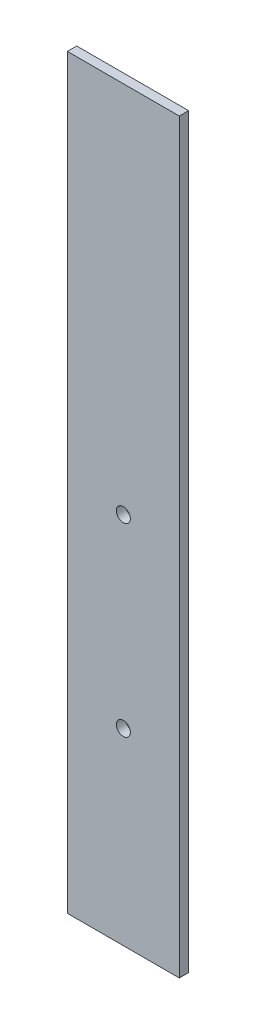
ISO-10303-21;
HEADER;
FILE_DESCRIPTION(('STEP AP214'),'2;1');
FILE_NAME('part.step','',(''),(''),'','','');
FILE_SCHEMA(('AUTOMOTIVE_DESIGN { 1 0 10303 214 1 1 1 1 }'));
ENDSEC;
DATA;
#1=APPLICATION_CONTEXT('core data for automotive mechanical design processes');
#2=APPLICATION_PROTOCOL_DEFINITION('international standard','automotive_design',2000,#1);
#3=PRODUCT_CONTEXT('',#1,'mechanical');
#4=PRODUCT('Part','Part','',(#3));
#5=PRODUCT_RELATED_PRODUCT_CATEGORY('part','',(#4));
#6=PRODUCT_DEFINITION_FORMATION('','',#4);
#7=PRODUCT_DEFINITION_CONTEXT('part definition',#1,'design');
#8=PRODUCT_DEFINITION('design','',#6,#7);
#9=PRODUCT_DEFINITION_SHAPE('','',#8);
#10=(LENGTH_UNIT() NAMED_UNIT(*) SI_UNIT(.MILLI.,.METRE.));
#11=(NAMED_UNIT(*) PLANE_ANGLE_UNIT() SI_UNIT($,.RADIAN.));
#12=(NAMED_UNIT(*) SI_UNIT($,.STERADIAN.) SOLID_ANGLE_UNIT());
#13=UNCERTAINTY_MEASURE_WITH_UNIT(LENGTH_MEASURE(1.E-05),#10,'distance_accuracy_value','');
#14=(GEOMETRIC_REPRESENTATION_CONTEXT(3) GLOBAL_UNCERTAINTY_ASSIGNED_CONTEXT((#13)) GLOBAL_UNIT_ASSIGNED_CONTEXT((#10,
#11,#12)) REPRESENTATION_CONTEXT('',''));
#15=CARTESIAN_POINT('',(0.,0.,0.));
#16=DIRECTION('',(0.,0.,1.));
#17=DIRECTION('',(1.,0.,0.));
#18=AXIS2_PLACEMENT_3D('',#15,#16,#17);
#19=CARTESIAN_POINT('',(0.,0.,3.175));
#20=DIRECTION('',(0.,0.,1.));
#21=DIRECTION('',(1.,0.,0.));
#22=AXIS2_PLACEMENT_3D('',#19,#20,#21);
#23=PLANE('',#22);
#24=CARTESIAN_POINT('',(19.05,-189.97100921089,3.175));
#25=DIRECTION('',(0.,0.,1.));
#26=DIRECTION('',(1.,0.,0.));
#27=AXIS2_PLACEMENT_3D('',#24,#25,#26);
#28=CIRCLE('',#27,2.38125);
#29=CARTESIAN_POINT('',(21.43125,-189.97100921089,3.175));
#30=VERTEX_POINT('',#29);
#31=EDGE_CURVE('E112',#30,#30,#28,.T.);
#32=ORIENTED_EDGE('',*,*,#31,.F.);
#33=EDGE_LOOP('',(#32));
#34=FACE_BOUND('',#33,.T.);
#35=DIRECTION('',(0.,-1.,0.));
#36=VECTOR('',#35,1.);
#37=CARTESIAN_POINT('',(0.,0.,3.175));
#38=LINE('',#37,#36);
#39=CARTESIAN_POINT('',(0.,0.,3.175));
#40=VERTEX_POINT('',#39);
#41=CARTESIAN_POINT('',(0.,-254.,3.175));
#42=VERTEX_POINT('',#41);
#43=EDGE_CURVE('E92',#40,#42,#38,.T.);
#44=ORIENTED_EDGE('',*,*,#43,.T.);
#45=DIRECTION('',(1.,0.,0.));
#46=VECTOR('',#45,1.);
#47=CARTESIAN_POINT('',(0.,-254.,3.175));
#48=LINE('',#47,#46);
#49=CARTESIAN_POINT('',(38.1,-254.,3.175));
#50=VERTEX_POINT('',#49);
#51=EDGE_CURVE('E87',#42,#50,#48,.T.);
#52=ORIENTED_EDGE('',*,*,#51,.T.);
#53=DIRECTION('',(0.,1.,0.));
#54=VECTOR('',#53,1.);
#55=CARTESIAN_POINT('',(38.1,0.,3.175));
#56=LINE('',#55,#54);
#57=CARTESIAN_POINT('',(38.1,0.,3.175));
#58=VERTEX_POINT('',#57);
#59=EDGE_CURVE('E90',#50,#58,#56,.T.);
#60=ORIENTED_EDGE('',*,*,#59,.T.);
#61=DIRECTION('',(-1.,0.,0.));
#62=VECTOR('',#61,1.);
#63=CARTESIAN_POINT('',(0.,0.,3.175));
#64=LINE('',#63,#62);
#65=EDGE_CURVE('E57',#58,#40,#64,.T.);
#66=ORIENTED_EDGE('',*,*,#65,.T.);
#67=EDGE_LOOP('',(#44,#52,#60,#66));
#68=FACE_BOUND('',#67,.T.);
#69=CARTESIAN_POINT('',(19.05,-127.,3.175));
#70=DIRECTION('',(0.,0.,1.));
#71=DIRECTION('',(1.,0.,0.));
#72=AXIS2_PLACEMENT_3D('',#69,#70,#71);
#73=CIRCLE('',#72,2.38125);
#74=CARTESIAN_POINT('',(21.43125,-127.,3.175));
#75=VERTEX_POINT('',#74);
#76=EDGE_CURVE('E134',#75,#75,#73,.T.);
#77=ORIENTED_EDGE('',*,*,#76,.F.);
#78=EDGE_LOOP('',(#77));
#79=FACE_BOUND('',#78,.T.);
#80=ADVANCED_FACE('F39',(#34,#68,#79),#23,.T.);
#81=CARTESIAN_POINT('',(0.,0.,0.));
#82=DIRECTION('',(0.,0.,1.));
#83=DIRECTION('',(1.,0.,0.));
#84=AXIS2_PLACEMENT_3D('',#81,#82,#83);
#85=PLANE('',#84);
#86=DIRECTION('',(0.,-1.,0.));
#87=VECTOR('',#86,1.);
#88=CARTESIAN_POINT('',(0.,0.,0.));
#89=LINE('',#88,#87);
#90=CARTESIAN_POINT('',(0.,0.,0.));
#91=VERTEX_POINT('',#90);
#92=CARTESIAN_POINT('',(0.,-254.,0.));
#93=VERTEX_POINT('',#92);
#94=EDGE_CURVE('E108',#91,#93,#89,.T.);
#95=ORIENTED_EDGE('',*,*,#94,.F.);
#96=DIRECTION('',(-1.,0.,0.));
#97=VECTOR('',#96,1.);
#98=CARTESIAN_POINT('',(0.,0.,0.));
#99=LINE('',#98,#97);
#100=CARTESIAN_POINT('',(38.1,0.,0.));
#101=VERTEX_POINT('',#100);
#102=EDGE_CURVE('E80',#101,#91,#99,.T.);
#103=ORIENTED_EDGE('',*,*,#102,.F.);
#104=DIRECTION('',(0.,1.,0.));
#105=VECTOR('',#104,1.);
#106=CARTESIAN_POINT('',(38.1,0.,0.));
#107=LINE('',#106,#105);
#108=CARTESIAN_POINT('',(38.1,-254.,0.));
#109=VERTEX_POINT('',#108);
#110=EDGE_CURVE('E74',#109,#101,#107,.T.);
#111=ORIENTED_EDGE('',*,*,#110,.F.);
#112=DIRECTION('',(1.,0.,0.));
#113=VECTOR('',#112,1.);
#114=CARTESIAN_POINT('',(0.,-254.,0.));
#115=LINE('',#114,#113);
#116=EDGE_CURVE('E97',#93,#109,#115,.T.);
#117=ORIENTED_EDGE('',*,*,#116,.F.);
#118=EDGE_LOOP('',(#95,#103,#111,#117));
#119=FACE_BOUND('',#118,.T.);
#120=CARTESIAN_POINT('',(19.05,-189.97100921089,0.));
#121=DIRECTION('',(0.,0.,1.));
#122=DIRECTION('',(1.,0.,0.));
#123=AXIS2_PLACEMENT_3D('',#120,#121,#122);
#124=CIRCLE('',#123,2.38125);
#125=CARTESIAN_POINT('',(21.43125,-189.97100921089,0.));
#126=VERTEX_POINT('',#125);
#127=EDGE_CURVE('E130',#126,#126,#124,.T.);
#128=ORIENTED_EDGE('',*,*,#127,.T.);
#129=EDGE_LOOP('',(#128));
#130=FACE_BOUND('',#129,.T.);
#131=CARTESIAN_POINT('',(19.05,-127.,0.));
#132=DIRECTION('',(0.,0.,1.));
#133=DIRECTION('',(1.,0.,0.));
#134=AXIS2_PLACEMENT_3D('',#131,#132,#133);
#135=CIRCLE('',#134,2.38125);
#136=CARTESIAN_POINT('',(21.43125,-127.,0.));
#137=VERTEX_POINT('',#136);
#138=EDGE_CURVE('E138',#137,#137,#135,.T.);
#139=ORIENTED_EDGE('',*,*,#138,.T.);
#140=EDGE_LOOP('',(#139));
#141=FACE_BOUND('',#140,.T.);
#142=ADVANCED_FACE('F125',(#119,#130,#141),#85,.F.);
#143=CARTESIAN_POINT('',(0.,0.,3.175));
#144=DIRECTION('',(1.,0.,0.));
#145=DIRECTION('',(0.,0.,-1.));
#146=AXIS2_PLACEMENT_3D('',#143,#144,#145);
#147=PLANE('',#146);
#148=ORIENTED_EDGE('',*,*,#94,.T.);
#149=DIRECTION('',(0.,0.,-1.));
#150=VECTOR('',#149,1.);
#151=CARTESIAN_POINT('',(0.,-254.,3.175));
#152=LINE('',#151,#150);
#153=EDGE_CURVE('E11',#42,#93,#152,.T.);
#154=ORIENTED_EDGE('',*,*,#153,.F.);
#155=ORIENTED_EDGE('',*,*,#43,.F.);
#156=DIRECTION('',(0.,0.,-1.));
#157=VECTOR('',#156,1.);
#158=CARTESIAN_POINT('',(0.,0.,3.175));
#159=LINE('',#158,#157);
#160=EDGE_CURVE('E104',#40,#91,#159,.T.);
#161=ORIENTED_EDGE('',*,*,#160,.T.);
#162=EDGE_LOOP('',(#148,#154,#155,#161));
#163=FACE_BOUND('',#162,.T.);
#164=ADVANCED_FACE('F41',(#163),#147,.F.);
#165=CARTESIAN_POINT('',(0.,-254.,3.175));
#166=DIRECTION('',(0.,1.,0.));
#167=DIRECTION('',(0.,0.,1.));
#168=AXIS2_PLACEMENT_3D('',#165,#166,#167);
#169=PLANE('',#168);
#170=ORIENTED_EDGE('',*,*,#116,.T.);
#171=DIRECTION('',(0.,0.,-1.));
#172=VECTOR('',#171,1.);
#173=CARTESIAN_POINT('',(38.1,-254.,3.175));
#174=LINE('',#173,#172);
#175=EDGE_CURVE('E49',#50,#109,#174,.T.);
#176=ORIENTED_EDGE('',*,*,#175,.F.);
#177=ORIENTED_EDGE('',*,*,#51,.F.);
#178=ORIENTED_EDGE('',*,*,#153,.T.);
#179=EDGE_LOOP('',(#170,#176,#177,#178));
#180=FACE_BOUND('',#179,.T.);
#181=ADVANCED_FACE('F96',(#180),#169,.F.);
#182=CARTESIAN_POINT('',(38.1,0.,3.175));
#183=DIRECTION('',(-1.,0.,0.));
#184=DIRECTION('',(0.,-1.,0.));
#185=AXIS2_PLACEMENT_3D('',#182,#183,#184);
#186=PLANE('',#185);
#187=ORIENTED_EDGE('',*,*,#110,.T.);
#188=DIRECTION('',(0.,0.,-1.));
#189=VECTOR('',#188,1.);
#190=CARTESIAN_POINT('',(38.1,0.,3.175));
#191=LINE('',#190,#189);
#192=EDGE_CURVE('E99',#58,#101,#191,.T.);
#193=ORIENTED_EDGE('',*,*,#192,.F.);
#194=ORIENTED_EDGE('',*,*,#59,.F.);
#195=ORIENTED_EDGE('',*,*,#175,.T.);
#196=EDGE_LOOP('',(#187,#193,#194,#195));
#197=FACE_BOUND('',#196,.T.);
#198=ADVANCED_FACE('F100',(#197),#186,.F.);
#199=CARTESIAN_POINT('',(0.,0.,3.175));
#200=DIRECTION('',(0.,-1.,0.));
#201=DIRECTION('',(0.,0.,-1.));
#202=AXIS2_PLACEMENT_3D('',#199,#200,#201);
#203=PLANE('',#202);
#204=ORIENTED_EDGE('',*,*,#102,.T.);
#205=ORIENTED_EDGE('',*,*,#160,.F.);
#206=ORIENTED_EDGE('',*,*,#65,.F.);
#207=ORIENTED_EDGE('',*,*,#192,.T.);
#208=EDGE_LOOP('',(#204,#205,#206,#207));
#209=FACE_BOUND('',#208,.T.);
#210=ADVANCED_FACE('F122',(#209),#203,.F.);
#211=CARTESIAN_POINT('',(19.05,-189.97100921089,3.175));
#212=DIRECTION('',(0.,0.,-1.));
#213=DIRECTION('',(-1.,0.,0.));
#214=AXIS2_PLACEMENT_3D('',#211,#212,#213);
#215=CYLINDRICAL_SURFACE('',#214,2.38125);
#216=ORIENTED_EDGE('',*,*,#31,.T.);
#217=EDGE_LOOP('',(#216));
#218=FACE_BOUND('',#217,.T.);
#219=ORIENTED_EDGE('',*,*,#127,.F.);
#220=EDGE_LOOP('',(#219));
#221=FACE_BOUND('',#220,.T.);
#222=ADVANCED_FACE('F157',(#218,#221),#215,.F.);
#223=CARTESIAN_POINT('',(19.05,-127.,3.175));
#224=DIRECTION('',(0.,0.,-1.));
#225=DIRECTION('',(-1.,0.,0.));
#226=AXIS2_PLACEMENT_3D('',#223,#224,#225);
#227=CYLINDRICAL_SURFACE('',#226,2.38125);
#228=ORIENTED_EDGE('',*,*,#76,.T.);
#229=EDGE_LOOP('',(#228));
#230=FACE_BOUND('',#229,.T.);
#231=ORIENTED_EDGE('',*,*,#138,.F.);
#232=EDGE_LOOP('',(#231));
#233=FACE_BOUND('',#232,.T.);
#234=ADVANCED_FACE('F146',(#230,#233),#227,.F.);
#235=CLOSED_SHELL('',(#80,#142,#164,#181,#198,#210,#222,#234));
#236=MANIFOLD_SOLID_BREP('B2',#235);
#237=ADVANCED_BREP_SHAPE_REPRESENTATION('',(#18,#236),#14);
#238=SHAPE_DEFINITION_REPRESENTATION(#9,#237);
ENDSEC;
END-ISO-10303-21;
